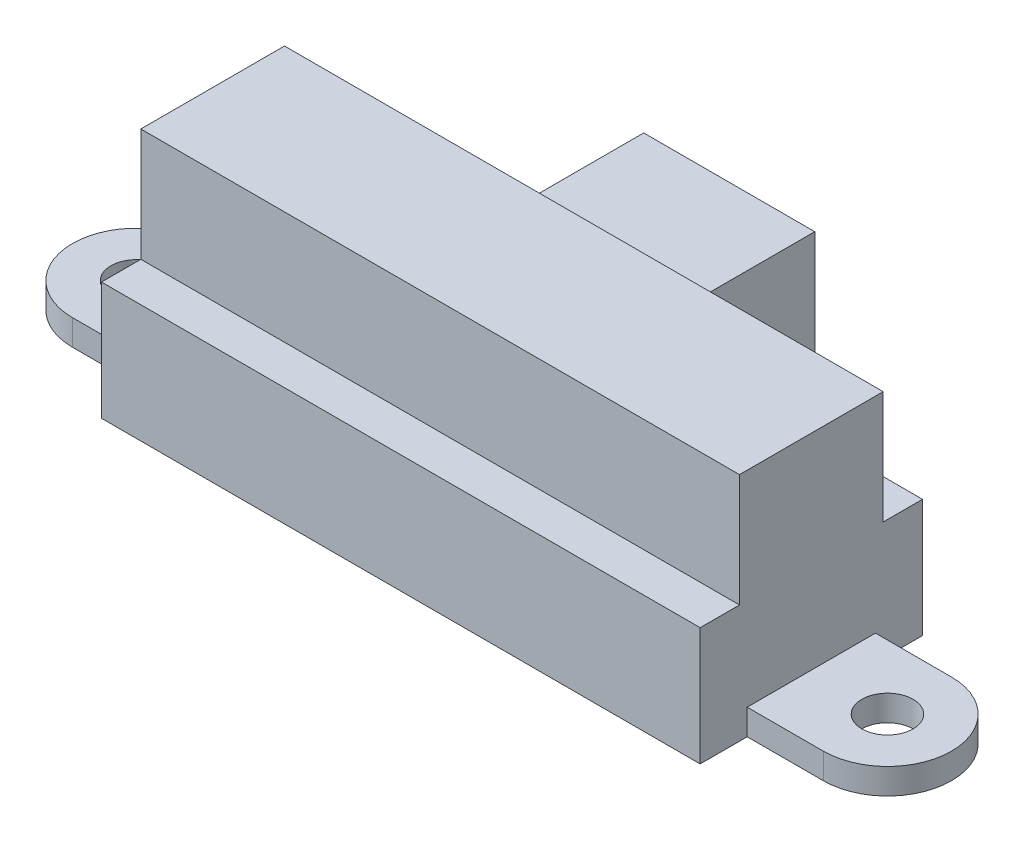
ISO-10303-21;
HEADER;
FILE_DESCRIPTION(('STEP AP214'),'2;1');
FILE_NAME('part.step','',(''),(''),'','','');
FILE_SCHEMA(('AUTOMOTIVE_DESIGN { 1 0 10303 214 1 1 1 1 }'));
ENDSEC;
DATA;
#1=APPLICATION_CONTEXT('core data for automotive mechanical design processes');
#2=APPLICATION_PROTOCOL_DEFINITION('international standard','automotive_design',2000,#1);
#3=PRODUCT_CONTEXT('',#1,'mechanical');
#4=PRODUCT('Part','Part','',(#3));
#5=PRODUCT_RELATED_PRODUCT_CATEGORY('part','',(#4));
#6=PRODUCT_DEFINITION_FORMATION('','',#4);
#7=PRODUCT_DEFINITION_CONTEXT('part definition',#1,'design');
#8=PRODUCT_DEFINITION('design','',#6,#7);
#9=PRODUCT_DEFINITION_SHAPE('','',#8);
#10=(LENGTH_UNIT() NAMED_UNIT(*) SI_UNIT(.MILLI.,.METRE.));
#11=(NAMED_UNIT(*) PLANE_ANGLE_UNIT() SI_UNIT($,.RADIAN.));
#12=(NAMED_UNIT(*) SI_UNIT($,.STERADIAN.) SOLID_ANGLE_UNIT());
#13=UNCERTAINTY_MEASURE_WITH_UNIT(LENGTH_MEASURE(1.E-05),#10,'distance_accuracy_value','');
#14=(GEOMETRIC_REPRESENTATION_CONTEXT(3) GLOBAL_UNCERTAINTY_ASSIGNED_CONTEXT((#13)) GLOBAL_UNIT_ASSIGNED_CONTEXT((#10,
#11,#12)) REPRESENTATION_CONTEXT('',''));
#15=CARTESIAN_POINT('',(0.,0.,0.));
#16=DIRECTION('',(0.,0.,1.));
#17=DIRECTION('',(1.,0.,0.));
#18=AXIS2_PLACEMENT_3D('',#15,#16,#17);
#19=CARTESIAN_POINT('',(0.,6.9,0.));
#20=DIRECTION('',(0.,1.,0.));
#21=DIRECTION('',(0.,0.,1.));
#22=AXIS2_PLACEMENT_3D('',#19,#20,#21);
#23=PLANE('',#22);
#24=DIRECTION('',(0.,0.,1.));
#25=VECTOR('',#24,1.);
#26=CARTESIAN_POINT('',(-5.,6.9,0.));
#27=LINE('',#26,#25);
#28=CARTESIAN_POINT('',(-5.,6.9,-6.5));
#29=VERTEX_POINT('',#28);
#30=CARTESIAN_POINT('',(-5.,6.9,-4.2));
#31=VERTEX_POINT('',#30);
#32=EDGE_CURVE('E208',#29,#31,#27,.T.);
#33=ORIENTED_EDGE('',*,*,#32,.F.);
#34=DIRECTION('',(-1.,0.,0.));
#35=VECTOR('',#34,1.);
#36=CARTESIAN_POINT('',(17.5,6.9,-6.5));
#37=LINE('',#36,#35);
#38=CARTESIAN_POINT('',(-17.5,6.9,-6.5));
#39=VERTEX_POINT('',#38);
#40=EDGE_CURVE('E235',#29,#39,#37,.T.);
#41=ORIENTED_EDGE('',*,*,#40,.T.);
#42=DIRECTION('',(0.,0.,1.));
#43=VECTOR('',#42,1.);
#44=CARTESIAN_POINT('',(-17.5,6.9,-6.5));
#45=LINE('',#44,#43);
#46=CARTESIAN_POINT('',(-17.5,6.9,-4.2));
#47=VERTEX_POINT('',#46);
#48=EDGE_CURVE('E234',#39,#47,#45,.T.);
#49=ORIENTED_EDGE('',*,*,#48,.T.);
#50=DIRECTION('',(1.,0.,0.));
#51=VECTOR('',#50,1.);
#52=CARTESIAN_POINT('',(-17.5,6.9,-4.2));
#53=LINE('',#52,#51);
#54=EDGE_CURVE('E238',#47,#31,#53,.T.);
#55=ORIENTED_EDGE('',*,*,#54,.T.);
#56=EDGE_LOOP('',(#33,#41,#49,#55));
#57=FACE_BOUND('',#56,.T.);
#58=ADVANCED_FACE('F33',(#57),#23,.T.);
#59=CARTESIAN_POINT('',(-17.5,13.5,-6.5));
#60=DIRECTION('',(0.,0.,1.));
#61=DIRECTION('',(1.,0.,0.));
#62=AXIS2_PLACEMENT_3D('',#59,#60,#61);
#63=PLANE('',#62);
#64=DIRECTION('',(0.,-1.,0.));
#65=VECTOR('',#64,1.);
#66=CARTESIAN_POINT('',(5.,11.1,-6.5));
#67=LINE('',#66,#65);
#68=CARTESIAN_POINT('',(5.,6.9,-6.5));
#69=VERTEX_POINT('',#68);
#70=CARTESIAN_POINT('',(5.,4.9,-6.5));
#71=VERTEX_POINT('',#70);
#72=EDGE_CURVE('E11',#69,#71,#67,.T.);
#73=ORIENTED_EDGE('',*,*,#72,.F.);
#74=CARTESIAN_POINT('',(17.5,6.9,-6.5));
#75=VERTEX_POINT('',#74);
#76=EDGE_CURVE('E231',#75,#69,#37,.T.);
#77=ORIENTED_EDGE('',*,*,#76,.F.);
#78=DIRECTION('',(0.,-1.,0.));
#79=VECTOR('',#78,1.);
#80=CARTESIAN_POINT('',(17.5,13.5,-6.5));
#81=LINE('',#80,#79);
#82=CARTESIAN_POINT('',(17.5,0.,-6.5));
#83=VERTEX_POINT('',#82);
#84=EDGE_CURVE('E37',#75,#83,#81,.T.);
#85=ORIENTED_EDGE('',*,*,#84,.T.);
#86=DIRECTION('',(-1.,0.,0.));
#87=VECTOR('',#86,1.);
#88=CARTESIAN_POINT('',(-17.5,0.,-6.5));
#89=LINE('',#88,#87);
#90=CARTESIAN_POINT('',(-17.5,0.,-6.5));
#91=VERTEX_POINT('',#90);
#92=EDGE_CURVE('E349',#83,#91,#89,.T.);
#93=ORIENTED_EDGE('',*,*,#92,.T.);
#94=DIRECTION('',(0.,-1.,0.));
#95=VECTOR('',#94,1.);
#96=CARTESIAN_POINT('',(-17.5,13.5,-6.5));
#97=LINE('',#96,#95);
#98=EDGE_CURVE('E360',#39,#91,#97,.T.);
#99=ORIENTED_EDGE('',*,*,#98,.F.);
#100=ORIENTED_EDGE('',*,*,#40,.F.);
#101=DIRECTION('',(0.,1.,0.));
#102=VECTOR('',#101,1.);
#103=CARTESIAN_POINT('',(-5.,11.1,-6.5));
#104=LINE('',#103,#102);
#105=CARTESIAN_POINT('',(-5.,4.9,-6.5));
#106=VERTEX_POINT('',#105);
#107=EDGE_CURVE('E215',#106,#29,#104,.T.);
#108=ORIENTED_EDGE('',*,*,#107,.F.);
#109=DIRECTION('',(-1.,0.,0.));
#110=VECTOR('',#109,1.);
#111=CARTESIAN_POINT('',(5.,4.9,-6.5));
#112=LINE('',#111,#110);
#113=EDGE_CURVE('E49',#71,#106,#112,.T.);
#114=ORIENTED_EDGE('',*,*,#113,.F.);
#115=EDGE_LOOP('',(#73,#77,#85,#93,#99,#100,#108,#114));
#116=FACE_BOUND('',#115,.T.);
#117=ADVANCED_FACE('F367',(#116),#63,.F.);
#118=CARTESIAN_POINT('',(-17.5,13.5,-6.5));
#119=DIRECTION('',(1.,0.,0.));
#120=DIRECTION('',(0.,0.,-1.));
#121=AXIS2_PLACEMENT_3D('',#118,#119,#120);
#122=PLANE('',#121);
#123=DIRECTION('',(0.,0.,1.));
#124=VECTOR('',#123,1.);
#125=CARTESIAN_POINT('',(-17.5,13.5,-6.5));
#126=LINE('',#125,#124);
#127=CARTESIAN_POINT('',(-17.5,13.5,-4.2));
#128=VERTEX_POINT('',#127);
#129=CARTESIAN_POINT('',(-17.5,13.5,4.2));
#130=VERTEX_POINT('',#129);
#131=EDGE_CURVE('E341',#128,#130,#126,.T.);
#132=ORIENTED_EDGE('',*,*,#131,.F.);
#133=DIRECTION('',(0.,1.,0.));
#134=VECTOR('',#133,1.);
#135=CARTESIAN_POINT('',(-17.5,6.9,-4.2));
#136=LINE('',#135,#134);
#137=EDGE_CURVE('E243',#47,#128,#136,.T.);
#138=ORIENTED_EDGE('',*,*,#137,.F.);
#139=ORIENTED_EDGE('',*,*,#48,.F.);
#140=ORIENTED_EDGE('',*,*,#98,.T.);
#141=DIRECTION('',(0.,0.,1.));
#142=VECTOR('',#141,1.);
#143=CARTESIAN_POINT('',(-17.5,0.,-6.5));
#144=LINE('',#143,#142);
#145=CARTESIAN_POINT('',(-17.5,0.,-3.75));
#146=VERTEX_POINT('',#145);
#147=EDGE_CURVE('E353',#91,#146,#144,.T.);
#148=ORIENTED_EDGE('',*,*,#147,.T.);
#149=DIRECTION('',(0.,-1.,0.));
#150=VECTOR('',#149,1.);
#151=CARTESIAN_POINT('',(-17.5,1.5,-3.75));
#152=LINE('',#151,#150);
#153=CARTESIAN_POINT('',(-17.5,1.5,-3.75));
#154=VERTEX_POINT('',#153);
#155=EDGE_CURVE('E303',#154,#146,#152,.T.);
#156=ORIENTED_EDGE('',*,*,#155,.F.);
#157=DIRECTION('',(0.,0.,1.));
#158=VECTOR('',#157,1.);
#159=CARTESIAN_POINT('',(-17.5,1.5,3.75));
#160=LINE('',#159,#158);
#161=CARTESIAN_POINT('',(-17.5,1.5,3.75));
#162=VERTEX_POINT('',#161);
#163=EDGE_CURVE('E288',#154,#162,#160,.T.);
#164=ORIENTED_EDGE('',*,*,#163,.T.);
#165=DIRECTION('',(0.,-1.,0.));
#166=VECTOR('',#165,1.);
#167=CARTESIAN_POINT('',(-17.5,1.5,3.75));
#168=LINE('',#167,#166);
#169=CARTESIAN_POINT('',(-17.5,0.,3.75));
#170=VERTEX_POINT('',#169);
#171=EDGE_CURVE('E299',#162,#170,#168,.T.);
#172=ORIENTED_EDGE('',*,*,#171,.T.);
#173=CARTESIAN_POINT('',(-17.5,0.,6.5));
#174=VERTEX_POINT('',#173);
#175=EDGE_CURVE('E352',#170,#174,#144,.T.);
#176=ORIENTED_EDGE('',*,*,#175,.T.);
#177=DIRECTION('',(0.,-1.,0.));
#178=VECTOR('',#177,1.);
#179=CARTESIAN_POINT('',(-17.5,13.5,6.5));
#180=LINE('',#179,#178);
#181=CARTESIAN_POINT('',(-17.5,6.9,6.5));
#182=VERTEX_POINT('',#181);
#183=EDGE_CURVE('E359',#182,#174,#180,.T.);
#184=ORIENTED_EDGE('',*,*,#183,.F.);
#185=DIRECTION('',(0.,0.,1.));
#186=VECTOR('',#185,1.);
#187=CARTESIAN_POINT('',(-17.5,6.9,6.5));
#188=LINE('',#187,#186);
#189=CARTESIAN_POINT('',(-17.5,6.9,4.2));
#190=VERTEX_POINT('',#189);
#191=EDGE_CURVE('E260',#190,#182,#188,.T.);
#192=ORIENTED_EDGE('',*,*,#191,.F.);
#193=DIRECTION('',(0.,1.,0.));
#194=VECTOR('',#193,1.);
#195=CARTESIAN_POINT('',(-17.5,6.9,4.2));
#196=LINE('',#195,#194);
#197=EDGE_CURVE('E246',#190,#130,#196,.T.);
#198=ORIENTED_EDGE('',*,*,#197,.T.);
#199=EDGE_LOOP('',(#132,#138,#139,#140,#148,#156,#164,#172,#176,#184,#192,#198));
#200=FACE_BOUND('',#199,.T.);
#201=ADVANCED_FACE('F379',(#200),#122,.F.);
#202=CARTESIAN_POINT('',(17.5,13.5,-6.5));
#203=DIRECTION('',(-1.,0.,0.));
#204=DIRECTION('',(0.,0.,1.));
#205=AXIS2_PLACEMENT_3D('',#202,#203,#204);
#206=PLANE('',#205);
#207=DIRECTION('',(0.,0.,-1.));
#208=VECTOR('',#207,1.);
#209=CARTESIAN_POINT('',(17.5,6.9,-4.2));
#210=LINE('',#209,#208);
#211=CARTESIAN_POINT('',(17.5,6.9,-4.2));
#212=VERTEX_POINT('',#211);
#213=EDGE_CURVE('E241',#212,#75,#210,.T.);
#214=ORIENTED_EDGE('',*,*,#213,.F.);
#215=DIRECTION('',(0.,1.,0.));
#216=VECTOR('',#215,1.);
#217=CARTESIAN_POINT('',(17.5,6.9,-4.2));
#218=LINE('',#217,#216);
#219=CARTESIAN_POINT('',(17.5,13.5,-4.2));
#220=VERTEX_POINT('',#219);
#221=EDGE_CURVE('E247',#212,#220,#218,.T.);
#222=ORIENTED_EDGE('',*,*,#221,.T.);
#223=DIRECTION('',(0.,0.,-1.));
#224=VECTOR('',#223,1.);
#225=CARTESIAN_POINT('',(17.5,13.5,-6.5));
#226=LINE('',#225,#224);
#227=CARTESIAN_POINT('',(17.5,13.5,4.2));
#228=VERTEX_POINT('',#227);
#229=EDGE_CURVE('E338',#228,#220,#226,.T.);
#230=ORIENTED_EDGE('',*,*,#229,.F.);
#231=DIRECTION('',(0.,1.,0.));
#232=VECTOR('',#231,1.);
#233=CARTESIAN_POINT('',(17.5,6.9,4.2));
#234=LINE('',#233,#232);
#235=CARTESIAN_POINT('',(17.5,6.9,4.2));
#236=VERTEX_POINT('',#235);
#237=EDGE_CURVE('E262',#236,#228,#234,.T.);
#238=ORIENTED_EDGE('',*,*,#237,.F.);
#239=DIRECTION('',(0.,0.,-1.));
#240=VECTOR('',#239,1.);
#241=CARTESIAN_POINT('',(17.5,6.9,4.2));
#242=LINE('',#241,#240);
#243=CARTESIAN_POINT('',(17.5,6.9,6.5));
#244=VERTEX_POINT('',#243);
#245=EDGE_CURVE('E254',#244,#236,#242,.T.);
#246=ORIENTED_EDGE('',*,*,#245,.F.);
#247=DIRECTION('',(0.,-1.,0.));
#248=VECTOR('',#247,1.);
#249=CARTESIAN_POINT('',(17.5,13.5,6.5));
#250=LINE('',#249,#248);
#251=CARTESIAN_POINT('',(17.5,0.,6.5));
#252=VERTEX_POINT('',#251);
#253=EDGE_CURVE('E345',#244,#252,#250,.T.);
#254=ORIENTED_EDGE('',*,*,#253,.T.);
#255=DIRECTION('',(0.,0.,-1.));
#256=VECTOR('',#255,1.);
#257=CARTESIAN_POINT('',(17.5,0.,-6.5));
#258=LINE('',#257,#256);
#259=CARTESIAN_POINT('',(17.5,0.,3.75));
#260=VERTEX_POINT('',#259);
#261=EDGE_CURVE('E346',#252,#260,#258,.T.);
#262=ORIENTED_EDGE('',*,*,#261,.T.);
#263=DIRECTION('',(0.,-1.,0.));
#264=VECTOR('',#263,1.);
#265=CARTESIAN_POINT('',(17.5,1.5,3.75));
#266=LINE('',#265,#264);
#267=CARTESIAN_POINT('',(17.5,1.5,3.75));
#268=VERTEX_POINT('',#267);
#269=EDGE_CURVE('E321',#268,#260,#266,.T.);
#270=ORIENTED_EDGE('',*,*,#269,.F.);
#271=DIRECTION('',(0.,0.,-1.));
#272=VECTOR('',#271,1.);
#273=CARTESIAN_POINT('',(17.5,1.5,3.75));
#274=LINE('',#273,#272);
#275=CARTESIAN_POINT('',(17.5,1.5,-3.75));
#276=VERTEX_POINT('',#275);
#277=EDGE_CURVE('E311',#268,#276,#274,.T.);
#278=ORIENTED_EDGE('',*,*,#277,.T.);
#279=DIRECTION('',(0.,-1.,0.));
#280=VECTOR('',#279,1.);
#281=CARTESIAN_POINT('',(17.5,1.5,-3.75));
#282=LINE('',#281,#280);
#283=CARTESIAN_POINT('',(17.5,0.,-3.75));
#284=VERTEX_POINT('',#283);
#285=EDGE_CURVE('E334',#276,#284,#282,.T.);
#286=ORIENTED_EDGE('',*,*,#285,.T.);
#287=EDGE_CURVE('E331',#284,#83,#258,.T.);
#288=ORIENTED_EDGE('',*,*,#287,.T.);
#289=ORIENTED_EDGE('',*,*,#84,.F.);
#290=EDGE_LOOP('',(#214,#222,#230,#238,#246,#254,#262,#270,#278,#286,#288,#289));
#291=FACE_BOUND('',#290,.T.);
#292=ADVANCED_FACE('F35',(#291),#206,.F.);
#293=CARTESIAN_POINT('',(-17.5,13.5,6.5));
#294=DIRECTION('',(0.,0.,-1.));
#295=DIRECTION('',(-1.,0.,0.));
#296=AXIS2_PLACEMENT_3D('',#293,#294,#295);
#297=PLANE('',#296);
#298=ORIENTED_EDGE('',*,*,#253,.F.);
#299=DIRECTION('',(1.,0.,0.));
#300=VECTOR('',#299,1.);
#301=CARTESIAN_POINT('',(17.5,6.9,6.5));
#302=LINE('',#301,#300);
#303=EDGE_CURVE('E252',#182,#244,#302,.T.);
#304=ORIENTED_EDGE('',*,*,#303,.F.);
#305=ORIENTED_EDGE('',*,*,#183,.T.);
#306=DIRECTION('',(1.,0.,0.));
#307=VECTOR('',#306,1.);
#308=CARTESIAN_POINT('',(-17.5,0.,6.5));
#309=LINE('',#308,#307);
#310=EDGE_CURVE('E342',#174,#252,#309,.T.);
#311=ORIENTED_EDGE('',*,*,#310,.T.);
#312=EDGE_LOOP('',(#298,#304,#305,#311));
#313=FACE_BOUND('',#312,.T.);
#314=ADVANCED_FACE('F397',(#313),#297,.F.);
#315=CARTESIAN_POINT('',(0.,13.5,0.));
#316=DIRECTION('',(0.,1.,0.));
#317=DIRECTION('',(0.,0.,1.));
#318=AXIS2_PLACEMENT_3D('',#315,#316,#317);
#319=PLANE('',#318);
#320=DIRECTION('',(1.,0.,0.));
#321=VECTOR('',#320,1.);
#322=CARTESIAN_POINT('',(-17.5,13.5,-4.2));
#323=LINE('',#322,#321);
#324=EDGE_CURVE('E244',#128,#220,#323,.T.);
#325=ORIENTED_EDGE('',*,*,#324,.F.);
#326=ORIENTED_EDGE('',*,*,#131,.T.);
#327=DIRECTION('',(-1.,0.,0.));
#328=VECTOR('',#327,1.);
#329=CARTESIAN_POINT('',(-17.5,13.5,4.2));
#330=LINE('',#329,#328);
#331=EDGE_CURVE('E230',#228,#130,#330,.T.);
#332=ORIENTED_EDGE('',*,*,#331,.F.);
#333=ORIENTED_EDGE('',*,*,#229,.T.);
#334=EDGE_LOOP('',(#325,#326,#332,#333));
#335=FACE_BOUND('',#334,.T.);
#336=ADVANCED_FACE('F410',(#335),#319,.T.);
#337=CARTESIAN_POINT('',(0.,0.,0.));
#338=DIRECTION('',(0.,1.,0.));
#339=DIRECTION('',(0.,0.,1.));
#340=AXIS2_PLACEMENT_3D('',#337,#338,#339);
#341=PLANE('',#340);
#342=CARTESIAN_POINT('',(-21.95,0.,0.));
#343=DIRECTION('',(0.,-1.,0.));
#344=DIRECTION('',(0.,0.,1.));
#345=AXIS2_PLACEMENT_3D('',#342,#343,#344);
#346=CIRCLE('',#345,1.5);
#347=CARTESIAN_POINT('',(-21.95,0.,1.5));
#348=VERTEX_POINT('',#347);
#349=EDGE_CURVE('E267',#348,#348,#346,.T.);
#350=ORIENTED_EDGE('',*,*,#349,.F.);
#351=EDGE_LOOP('',(#350));
#352=FACE_BOUND('',#351,.T.);
#353=CARTESIAN_POINT('',(21.95,0.,0.));
#354=DIRECTION('',(0.,1.,0.));
#355=DIRECTION('',(0.,0.,1.));
#356=AXIS2_PLACEMENT_3D('',#353,#354,#355);
#357=CIRCLE('',#356,1.5);
#358=CARTESIAN_POINT('',(21.95,0.,1.5));
#359=VERTEX_POINT('',#358);
#360=EDGE_CURVE('E273',#359,#359,#357,.T.);
#361=ORIENTED_EDGE('',*,*,#360,.T.);
#362=EDGE_LOOP('',(#361));
#363=FACE_BOUND('',#362,.T.);
#364=ORIENTED_EDGE('',*,*,#261,.F.);
#365=ORIENTED_EDGE('',*,*,#310,.F.);
#366=ORIENTED_EDGE('',*,*,#175,.F.);
#367=DIRECTION('',(-1.,0.,0.));
#368=VECTOR('',#367,1.);
#369=CARTESIAN_POINT('',(-17.5,0.,3.75));
#370=LINE('',#369,#368);
#371=CARTESIAN_POINT('',(-21.95,0.,3.75));
#372=VERTEX_POINT('',#371);
#373=EDGE_CURVE('E276',#170,#372,#370,.T.);
#374=ORIENTED_EDGE('',*,*,#373,.T.);
#375=CARTESIAN_POINT('',(-21.95,0.,0.));
#376=DIRECTION('',(0.,-1.,0.));
#377=DIRECTION('',(0.,0.,-1.));
#378=AXIS2_PLACEMENT_3D('',#375,#376,#377);
#379=CIRCLE('',#378,3.75);
#380=CARTESIAN_POINT('',(-21.95,0.,-3.75));
#381=VERTEX_POINT('',#380);
#382=EDGE_CURVE('E294',#372,#381,#379,.T.);
#383=ORIENTED_EDGE('',*,*,#382,.T.);
#384=DIRECTION('',(1.,0.,0.));
#385=VECTOR('',#384,1.);
#386=CARTESIAN_POINT('',(-17.5,0.,-3.75));
#387=LINE('',#386,#385);
#388=EDGE_CURVE('E283',#381,#146,#387,.T.);
#389=ORIENTED_EDGE('',*,*,#388,.T.);
#390=ORIENTED_EDGE('',*,*,#147,.F.);
#391=ORIENTED_EDGE('',*,*,#92,.F.);
#392=ORIENTED_EDGE('',*,*,#287,.F.);
#393=DIRECTION('',(1.,0.,0.));
#394=VECTOR('',#393,1.);
#395=CARTESIAN_POINT('',(17.5,0.,-3.75));
#396=LINE('',#395,#394);
#397=CARTESIAN_POINT('',(21.95,0.,-3.75));
#398=VERTEX_POINT('',#397);
#399=EDGE_CURVE('E324',#284,#398,#396,.T.);
#400=ORIENTED_EDGE('',*,*,#399,.T.);
#401=CARTESIAN_POINT('',(21.95,0.,0.));
#402=DIRECTION('',(0.,-1.,0.));
#403=DIRECTION('',(0.,0.,1.));
#404=AXIS2_PLACEMENT_3D('',#401,#402,#403);
#405=CIRCLE('',#404,3.75);
#406=CARTESIAN_POINT('',(21.95,0.,3.75));
#407=VERTEX_POINT('',#406);
#408=EDGE_CURVE('E312',#398,#407,#405,.T.);
#409=ORIENTED_EDGE('',*,*,#408,.T.);
#410=DIRECTION('',(-1.,0.,0.));
#411=VECTOR('',#410,1.);
#412=CARTESIAN_POINT('',(17.5,0.,3.75));
#413=LINE('',#412,#411);
#414=EDGE_CURVE('E302',#407,#260,#413,.T.);
#415=ORIENTED_EDGE('',*,*,#414,.T.);
#416=EDGE_LOOP('',(#364,#365,#366,#374,#383,#389,#390,#391,#392,#400,#409,#415));
#417=FACE_BOUND('',#416,.T.);
#418=ADVANCED_FACE('F375',(#352,#363,#417),#341,.F.);
#419=CARTESIAN_POINT('',(17.5,1.5,3.75));
#420=DIRECTION('',(0.,0.,1.));
#421=DIRECTION('',(1.,0.,0.));
#422=AXIS2_PLACEMENT_3D('',#419,#420,#421);
#423=PLANE('',#422);
#424=ORIENTED_EDGE('',*,*,#414,.F.);
#425=DIRECTION('',(0.,-1.,0.));
#426=VECTOR('',#425,1.);
#427=CARTESIAN_POINT('',(21.95,1.5,3.75));
#428=LINE('',#427,#426);
#429=CARTESIAN_POINT('',(21.95,1.5,3.75));
#430=VERTEX_POINT('',#429);
#431=EDGE_CURVE('E329',#430,#407,#428,.T.);
#432=ORIENTED_EDGE('',*,*,#431,.F.);
#433=DIRECTION('',(-1.,0.,0.));
#434=VECTOR('',#433,1.);
#435=CARTESIAN_POINT('',(17.5,1.5,3.75));
#436=LINE('',#435,#434);
#437=EDGE_CURVE('E308',#430,#268,#436,.T.);
#438=ORIENTED_EDGE('',*,*,#437,.T.);
#439=ORIENTED_EDGE('',*,*,#269,.T.);
#440=EDGE_LOOP('',(#424,#432,#438,#439));
#441=FACE_BOUND('',#440,.T.);
#442=ADVANCED_FACE('F581',(#441),#423,.T.);
#443=CARTESIAN_POINT('',(21.95,1.5,0.));
#444=DIRECTION('',(0.,-1.,0.));
#445=DIRECTION('',(0.,0.,-1.));
#446=AXIS2_PLACEMENT_3D('',#443,#444,#445);
#447=CYLINDRICAL_SURFACE('',#446,3.75);
#448=ORIENTED_EDGE('',*,*,#408,.F.);
#449=DIRECTION('',(0.,-1.,0.));
#450=VECTOR('',#449,1.);
#451=CARTESIAN_POINT('',(21.95,1.5,-3.75));
#452=LINE('',#451,#450);
#453=CARTESIAN_POINT('',(21.95,1.5,-3.75));
#454=VERTEX_POINT('',#453);
#455=EDGE_CURVE('E332',#454,#398,#452,.T.);
#456=ORIENTED_EDGE('',*,*,#455,.F.);
#457=CARTESIAN_POINT('',(21.95,1.5,0.));
#458=DIRECTION('',(0.,-1.,0.));
#459=DIRECTION('',(0.,0.,1.));
#460=AXIS2_PLACEMENT_3D('',#457,#458,#459);
#461=CIRCLE('',#460,3.75);
#462=EDGE_CURVE('E318',#454,#430,#461,.T.);
#463=ORIENTED_EDGE('',*,*,#462,.T.);
#464=ORIENTED_EDGE('',*,*,#431,.T.);
#465=EDGE_LOOP('',(#448,#456,#463,#464));
#466=FACE_BOUND('',#465,.T.);
#467=ADVANCED_FACE('F573',(#466),#447,.T.);
#468=CARTESIAN_POINT('',(17.5,1.5,-3.75));
#469=DIRECTION('',(0.,0.,-1.));
#470=DIRECTION('',(-1.,0.,0.));
#471=AXIS2_PLACEMENT_3D('',#468,#469,#470);
#472=PLANE('',#471);
#473=ORIENTED_EDGE('',*,*,#399,.F.);
#474=ORIENTED_EDGE('',*,*,#285,.F.);
#475=DIRECTION('',(1.,0.,0.));
#476=VECTOR('',#475,1.);
#477=CARTESIAN_POINT('',(17.5,1.5,-3.75));
#478=LINE('',#477,#476);
#479=EDGE_CURVE('E315',#276,#454,#478,.T.);
#480=ORIENTED_EDGE('',*,*,#479,.T.);
#481=ORIENTED_EDGE('',*,*,#455,.T.);
#482=EDGE_LOOP('',(#473,#474,#480,#481));
#483=FACE_BOUND('',#482,.T.);
#484=ADVANCED_FACE('F566',(#483),#472,.T.);
#485=CARTESIAN_POINT('',(21.95,1.5,0.));
#486=DIRECTION('',(0.,1.,0.));
#487=DIRECTION('',(0.,0.,1.));
#488=AXIS2_PLACEMENT_3D('',#485,#486,#487);
#489=PLANE('',#488);
#490=CARTESIAN_POINT('',(21.95,1.5,0.));
#491=DIRECTION('',(0.,1.,0.));
#492=DIRECTION('',(0.,0.,1.));
#493=AXIS2_PLACEMENT_3D('',#490,#491,#492);
#494=CIRCLE('',#493,1.5);
#495=CARTESIAN_POINT('',(21.95,1.5,1.5));
#496=VERTEX_POINT('',#495);
#497=EDGE_CURVE('E270',#496,#496,#494,.T.);
#498=ORIENTED_EDGE('',*,*,#497,.F.);
#499=EDGE_LOOP('',(#498));
#500=FACE_BOUND('',#499,.T.);
#501=ORIENTED_EDGE('',*,*,#437,.F.);
#502=ORIENTED_EDGE('',*,*,#462,.F.);
#503=ORIENTED_EDGE('',*,*,#479,.F.);
#504=ORIENTED_EDGE('',*,*,#277,.F.);
#505=EDGE_LOOP('',(#501,#502,#503,#504));
#506=FACE_BOUND('',#505,.T.);
#507=ADVANCED_FACE('F559',(#500,#506),#489,.T.);
#508=CARTESIAN_POINT('',(-17.5,1.5,3.75));
#509=DIRECTION('',(0.,0.,1.));
#510=DIRECTION('',(1.,0.,0.));
#511=AXIS2_PLACEMENT_3D('',#508,#509,#510);
#512=PLANE('',#511);
#513=ORIENTED_EDGE('',*,*,#373,.F.);
#514=ORIENTED_EDGE('',*,*,#171,.F.);
#515=DIRECTION('',(-1.,0.,0.));
#516=VECTOR('',#515,1.);
#517=CARTESIAN_POINT('',(-17.5,1.5,3.75));
#518=LINE('',#517,#516);
#519=CARTESIAN_POINT('',(-21.95,1.5,3.75));
#520=VERTEX_POINT('',#519);
#521=EDGE_CURVE('E279',#162,#520,#518,.T.);
#522=ORIENTED_EDGE('',*,*,#521,.T.);
#523=DIRECTION('',(0.,-1.,0.));
#524=VECTOR('',#523,1.);
#525=CARTESIAN_POINT('',(-21.95,1.5,3.75));
#526=LINE('',#525,#524);
#527=EDGE_CURVE('E291',#520,#372,#526,.T.);
#528=ORIENTED_EDGE('',*,*,#527,.T.);
#529=EDGE_LOOP('',(#513,#514,#522,#528));
#530=FACE_BOUND('',#529,.T.);
#531=ADVANCED_FACE('F389',(#530),#512,.T.);
#532=CARTESIAN_POINT('',(-17.5,1.5,-3.75));
#533=DIRECTION('',(0.,0.,-1.));
#534=DIRECTION('',(-1.,0.,0.));
#535=AXIS2_PLACEMENT_3D('',#532,#533,#534);
#536=PLANE('',#535);
#537=ORIENTED_EDGE('',*,*,#388,.F.);
#538=DIRECTION('',(0.,-1.,0.));
#539=VECTOR('',#538,1.);
#540=CARTESIAN_POINT('',(-21.95,1.5,-3.75));
#541=LINE('',#540,#539);
#542=CARTESIAN_POINT('',(-21.95,1.5,-3.75));
#543=VERTEX_POINT('',#542);
#544=EDGE_CURVE('E305',#543,#381,#541,.T.);
#545=ORIENTED_EDGE('',*,*,#544,.F.);
#546=DIRECTION('',(1.,0.,0.));
#547=VECTOR('',#546,1.);
#548=CARTESIAN_POINT('',(-17.5,1.5,-3.75));
#549=LINE('',#548,#547);
#550=EDGE_CURVE('E286',#543,#154,#549,.T.);
#551=ORIENTED_EDGE('',*,*,#550,.T.);
#552=ORIENTED_EDGE('',*,*,#155,.T.);
#553=EDGE_LOOP('',(#537,#545,#551,#552));
#554=FACE_BOUND('',#553,.T.);
#555=ADVANCED_FACE('F382',(#554),#536,.T.);
#556=CARTESIAN_POINT('',(-21.95,1.5,0.));
#557=DIRECTION('',(0.,-1.,0.));
#558=DIRECTION('',(0.,0.,-1.));
#559=AXIS2_PLACEMENT_3D('',#556,#557,#558);
#560=CYLINDRICAL_SURFACE('',#559,3.75);
#561=ORIENTED_EDGE('',*,*,#382,.F.);
#562=ORIENTED_EDGE('',*,*,#527,.F.);
#563=CARTESIAN_POINT('',(-21.95,1.5,0.));
#564=DIRECTION('',(0.,-1.,0.));
#565=DIRECTION('',(0.,0.,-1.));
#566=AXIS2_PLACEMENT_3D('',#563,#564,#565);
#567=CIRCLE('',#566,3.75);
#568=EDGE_CURVE('E282',#520,#543,#567,.T.);
#569=ORIENTED_EDGE('',*,*,#568,.T.);
#570=ORIENTED_EDGE('',*,*,#544,.T.);
#571=EDGE_LOOP('',(#561,#562,#569,#570));
#572=FACE_BOUND('',#571,.T.);
#573=ADVANCED_FACE('F538',(#572),#560,.T.);
#574=CARTESIAN_POINT('',(-21.95,1.5,0.));
#575=DIRECTION('',(0.,-1.,0.));
#576=DIRECTION('',(0.,0.,-1.));
#577=AXIS2_PLACEMENT_3D('',#574,#575,#576);
#578=PLANE('',#577);
#579=CARTESIAN_POINT('',(-21.95,1.5,0.));
#580=DIRECTION('',(0.,-1.,0.));
#581=DIRECTION('',(0.,0.,1.));
#582=AXIS2_PLACEMENT_3D('',#579,#580,#581);
#583=CIRCLE('',#582,1.5);
#584=CARTESIAN_POINT('',(-21.95,1.5,1.5));
#585=VERTEX_POINT('',#584);
#586=EDGE_CURVE('E250',#585,#585,#583,.T.);
#587=ORIENTED_EDGE('',*,*,#586,.T.);
#588=EDGE_LOOP('',(#587));
#589=FACE_BOUND('',#588,.T.);
#590=ORIENTED_EDGE('',*,*,#521,.F.);
#591=ORIENTED_EDGE('',*,*,#163,.F.);
#592=ORIENTED_EDGE('',*,*,#550,.F.);
#593=ORIENTED_EDGE('',*,*,#568,.F.);
#594=EDGE_LOOP('',(#590,#591,#592,#593));
#595=FACE_BOUND('',#594,.T.);
#596=ADVANCED_FACE('F387',(#589,#595),#578,.F.);
#597=CARTESIAN_POINT('',(21.95,0.,0.));
#598=DIRECTION('',(0.,1.,0.));
#599=DIRECTION('',(0.,0.,1.));
#600=AXIS2_PLACEMENT_3D('',#597,#598,#599);
#601=CYLINDRICAL_SURFACE('',#600,1.5);
#602=ORIENTED_EDGE('',*,*,#360,.F.);
#603=EDGE_LOOP('',(#602));
#604=FACE_BOUND('',#603,.T.);
#605=ORIENTED_EDGE('',*,*,#497,.T.);
#606=EDGE_LOOP('',(#605));
#607=FACE_BOUND('',#606,.T.);
#608=ADVANCED_FACE('F520',(#604,#607),#601,.F.);
#609=CARTESIAN_POINT('',(-21.95,0.,0.));
#610=DIRECTION('',(0.,1.,0.));
#611=DIRECTION('',(0.,0.,1.));
#612=AXIS2_PLACEMENT_3D('',#609,#610,#611);
#613=CYLINDRICAL_SURFACE('',#612,1.5);
#614=ORIENTED_EDGE('',*,*,#349,.T.);
#615=EDGE_LOOP('',(#614));
#616=FACE_BOUND('',#615,.T.);
#617=ORIENTED_EDGE('',*,*,#586,.F.);
#618=EDGE_LOOP('',(#617));
#619=FACE_BOUND('',#618,.T.);
#620=ADVANCED_FACE('F512',(#616,#619),#613,.F.);
#621=CARTESIAN_POINT('',(-17.5,6.9,4.2));
#622=DIRECTION('',(0.,0.,-1.));
#623=DIRECTION('',(-1.,0.,0.));
#624=AXIS2_PLACEMENT_3D('',#621,#622,#623);
#625=PLANE('',#624);
#626=ORIENTED_EDGE('',*,*,#331,.T.);
#627=ORIENTED_EDGE('',*,*,#197,.F.);
#628=DIRECTION('',(-1.,0.,0.));
#629=VECTOR('',#628,1.);
#630=CARTESIAN_POINT('',(-17.5,6.9,4.2));
#631=LINE('',#630,#629);
#632=EDGE_CURVE('E257',#236,#190,#631,.T.);
#633=ORIENTED_EDGE('',*,*,#632,.F.);
#634=ORIENTED_EDGE('',*,*,#237,.T.);
#635=EDGE_LOOP('',(#626,#627,#633,#634));
#636=FACE_BOUND('',#635,.T.);
#637=ADVANCED_FACE('F405',(#636),#625,.F.);
#638=CARTESIAN_POINT('',(0.,6.9,0.));
#639=DIRECTION('',(0.,-1.,0.));
#640=DIRECTION('',(0.,0.,-1.));
#641=AXIS2_PLACEMENT_3D('',#638,#639,#640);
#642=PLANE('',#641);
#643=ORIENTED_EDGE('',*,*,#303,.T.);
#644=ORIENTED_EDGE('',*,*,#245,.T.);
#645=ORIENTED_EDGE('',*,*,#632,.T.);
#646=ORIENTED_EDGE('',*,*,#191,.T.);
#647=EDGE_LOOP('',(#643,#644,#645,#646));
#648=FACE_BOUND('',#647,.T.);
#649=ADVANCED_FACE('F401',(#648),#642,.F.);
#650=CARTESIAN_POINT('',(-17.5,6.9,-4.2));
#651=DIRECTION('',(0.,0.,1.));
#652=DIRECTION('',(1.,0.,0.));
#653=AXIS2_PLACEMENT_3D('',#650,#651,#652);
#654=PLANE('',#653);
#655=DIRECTION('',(1.,0.,0.));
#656=VECTOR('',#655,1.);
#657=CARTESIAN_POINT('',(5.,11.1,-4.2));
#658=LINE('',#657,#656);
#659=CARTESIAN_POINT('',(-5.,11.1,-4.2));
#660=VERTEX_POINT('',#659);
#661=CARTESIAN_POINT('',(5.,11.1,-4.2));
#662=VERTEX_POINT('',#661);
#663=EDGE_CURVE('E195',#660,#662,#658,.T.);
#664=ORIENTED_EDGE('',*,*,#663,.F.);
#665=DIRECTION('',(0.,1.,0.));
#666=VECTOR('',#665,1.);
#667=CARTESIAN_POINT('',(-5.,11.1,-4.2));
#668=LINE('',#667,#666);
#669=EDGE_CURVE('E201',#31,#660,#668,.T.);
#670=ORIENTED_EDGE('',*,*,#669,.F.);
#671=ORIENTED_EDGE('',*,*,#54,.F.);
#672=ORIENTED_EDGE('',*,*,#137,.T.);
#673=ORIENTED_EDGE('',*,*,#324,.T.);
#674=ORIENTED_EDGE('',*,*,#221,.F.);
#675=CARTESIAN_POINT('',(5.,6.9,-4.2));
#676=VERTEX_POINT('',#675);
#677=EDGE_CURVE('E206',#676,#212,#53,.T.);
#678=ORIENTED_EDGE('',*,*,#677,.F.);
#679=DIRECTION('',(0.,-1.,0.));
#680=VECTOR('',#679,1.);
#681=CARTESIAN_POINT('',(5.,11.1,-4.2));
#682=LINE('',#681,#680);
#683=EDGE_CURVE('E185',#662,#676,#682,.T.);
#684=ORIENTED_EDGE('',*,*,#683,.F.);
#685=EDGE_LOOP('',(#664,#670,#671,#672,#673,#674,#678,#684));
#686=FACE_BOUND('',#685,.T.);
#687=ADVANCED_FACE('F204',(#686),#654,.F.);
#688=DIRECTION('',(0.,0.,-1.));
#689=VECTOR('',#688,1.);
#690=CARTESIAN_POINT('',(5.,6.9,0.));
#691=LINE('',#690,#689);
#692=EDGE_CURVE('E55',#676,#69,#691,.T.);
#693=ORIENTED_EDGE('',*,*,#692,.F.);
#694=ORIENTED_EDGE('',*,*,#677,.T.);
#695=ORIENTED_EDGE('',*,*,#213,.T.);
#696=ORIENTED_EDGE('',*,*,#76,.T.);
#697=EDGE_LOOP('',(#693,#694,#695,#696));
#698=FACE_BOUND('',#697,.T.);
#699=ADVANCED_FACE('F421',(#698),#23,.T.);
#700=CARTESIAN_POINT('',(5.,11.1,-12.7));
#701=DIRECTION('',(-1.,0.,0.));
#702=DIRECTION('',(0.,-1.,0.));
#703=AXIS2_PLACEMENT_3D('',#700,#701,#702);
#704=PLANE('',#703);
#705=DIRECTION('',(0.,0.,1.));
#706=VECTOR('',#705,1.);
#707=CARTESIAN_POINT('',(5.,11.1,-12.7));
#708=LINE('',#707,#706);
#709=CARTESIAN_POINT('',(5.,11.1,-12.7));
#710=VERTEX_POINT('',#709);
#711=EDGE_CURVE('E181',#710,#662,#708,.T.);
#712=ORIENTED_EDGE('',*,*,#711,.T.);
#713=ORIENTED_EDGE('',*,*,#683,.T.);
#714=ORIENTED_EDGE('',*,*,#692,.T.);
#715=ORIENTED_EDGE('',*,*,#72,.T.);
#716=DIRECTION('',(0.,0.,1.));
#717=VECTOR('',#716,1.);
#718=CARTESIAN_POINT('',(5.,4.9,-12.7));
#719=LINE('',#718,#717);
#720=CARTESIAN_POINT('',(5.,4.9,-12.7));
#721=VERTEX_POINT('',#720);
#722=EDGE_CURVE('E227',#721,#71,#719,.T.);
#723=ORIENTED_EDGE('',*,*,#722,.F.);
#724=DIRECTION('',(0.,-1.,0.));
#725=VECTOR('',#724,1.);
#726=CARTESIAN_POINT('',(5.,11.1,-12.7));
#727=LINE('',#726,#725);
#728=EDGE_CURVE('E188',#710,#721,#727,.T.);
#729=ORIENTED_EDGE('',*,*,#728,.F.);
#730=EDGE_LOOP('',(#712,#713,#714,#715,#723,#729));
#731=FACE_BOUND('',#730,.T.);
#732=ADVANCED_FACE('F183',(#731),#704,.F.);
#733=CARTESIAN_POINT('',(5.,4.9,-12.7));
#734=DIRECTION('',(0.,1.,0.));
#735=DIRECTION('',(0.,0.,1.));
#736=AXIS2_PLACEMENT_3D('',#733,#734,#735);
#737=PLANE('',#736);
#738=ORIENTED_EDGE('',*,*,#113,.T.);
#739=DIRECTION('',(0.,0.,1.));
#740=VECTOR('',#739,1.);
#741=CARTESIAN_POINT('',(-5.,4.9,-12.7));
#742=LINE('',#741,#740);
#743=CARTESIAN_POINT('',(-5.,4.9,-12.7));
#744=VERTEX_POINT('',#743);
#745=EDGE_CURVE('E224',#744,#106,#742,.T.);
#746=ORIENTED_EDGE('',*,*,#745,.F.);
#747=DIRECTION('',(-1.,0.,0.));
#748=VECTOR('',#747,1.);
#749=CARTESIAN_POINT('',(5.,4.9,-12.7));
#750=LINE('',#749,#748);
#751=EDGE_CURVE('E214',#721,#744,#750,.T.);
#752=ORIENTED_EDGE('',*,*,#751,.F.);
#753=ORIENTED_EDGE('',*,*,#722,.T.);
#754=EDGE_LOOP('',(#738,#746,#752,#753));
#755=FACE_BOUND('',#754,.T.);
#756=ADVANCED_FACE('F419',(#755),#737,.F.);
#757=CARTESIAN_POINT('',(-5.,11.1,-12.7));
#758=DIRECTION('',(1.,0.,0.));
#759=DIRECTION('',(0.,1.,0.));
#760=AXIS2_PLACEMENT_3D('',#757,#758,#759);
#761=PLANE('',#760);
#762=ORIENTED_EDGE('',*,*,#107,.T.);
#763=ORIENTED_EDGE('',*,*,#32,.T.);
#764=ORIENTED_EDGE('',*,*,#669,.T.);
#765=DIRECTION('',(0.,0.,1.));
#766=VECTOR('',#765,1.);
#767=CARTESIAN_POINT('',(-5.,11.1,-12.7));
#768=LINE('',#767,#766);
#769=CARTESIAN_POINT('',(-5.,11.1,-12.7));
#770=VERTEX_POINT('',#769);
#771=EDGE_CURVE('E191',#770,#660,#768,.T.);
#772=ORIENTED_EDGE('',*,*,#771,.F.);
#773=DIRECTION('',(0.,1.,0.));
#774=VECTOR('',#773,1.);
#775=CARTESIAN_POINT('',(-5.,11.1,-12.7));
#776=LINE('',#775,#774);
#777=EDGE_CURVE('E217',#744,#770,#776,.T.);
#778=ORIENTED_EDGE('',*,*,#777,.F.);
#779=ORIENTED_EDGE('',*,*,#745,.T.);
#780=EDGE_LOOP('',(#762,#763,#764,#772,#778,#779));
#781=FACE_BOUND('',#780,.T.);
#782=ADVANCED_FACE('F415',(#781),#761,.F.);
#783=CARTESIAN_POINT('',(5.,11.1,-12.7));
#784=DIRECTION('',(0.,-1.,0.));
#785=DIRECTION('',(0.,0.,-1.));
#786=AXIS2_PLACEMENT_3D('',#783,#784,#785);
#787=PLANE('',#786);
#788=ORIENTED_EDGE('',*,*,#771,.T.);
#789=ORIENTED_EDGE('',*,*,#663,.T.);
#790=ORIENTED_EDGE('',*,*,#711,.F.);
#791=DIRECTION('',(1.,0.,0.));
#792=VECTOR('',#791,1.);
#793=CARTESIAN_POINT('',(5.,11.1,-12.7));
#794=LINE('',#793,#792);
#795=EDGE_CURVE('E192',#770,#710,#794,.T.);
#796=ORIENTED_EDGE('',*,*,#795,.F.);
#797=EDGE_LOOP('',(#788,#789,#790,#796));
#798=FACE_BOUND('',#797,.T.);
#799=ADVANCED_FACE('F196',(#798),#787,.F.);
#800=CARTESIAN_POINT('',(0.,0.,-12.7));
#801=DIRECTION('',(0.,0.,-1.));
#802=DIRECTION('',(-1.,0.,0.));
#803=AXIS2_PLACEMENT_3D('',#800,#801,#802);
#804=PLANE('',#803);
#805=ORIENTED_EDGE('',*,*,#728,.T.);
#806=ORIENTED_EDGE('',*,*,#751,.T.);
#807=ORIENTED_EDGE('',*,*,#777,.T.);
#808=ORIENTED_EDGE('',*,*,#795,.T.);
#809=EDGE_LOOP('',(#805,#806,#807,#808));
#810=FACE_BOUND('',#809,.T.);
#811=ADVANCED_FACE('F435',(#810),#804,.T.);
#812=CLOSED_SHELL('',(#58,#117,#201,#292,#314,#336,#418,#442,#467,#484,#507,#531,#555,#573,#596,
#608,#620,#637,#649,#687,#699,#732,#756,#782,#799,#811));
#813=MANIFOLD_SOLID_BREP('B2',#812);
#814=ADVANCED_BREP_SHAPE_REPRESENTATION('',(#18,#813),#14);
#815=SHAPE_DEFINITION_REPRESENTATION(#9,#814);
ENDSEC;
END-ISO-10303-21;
